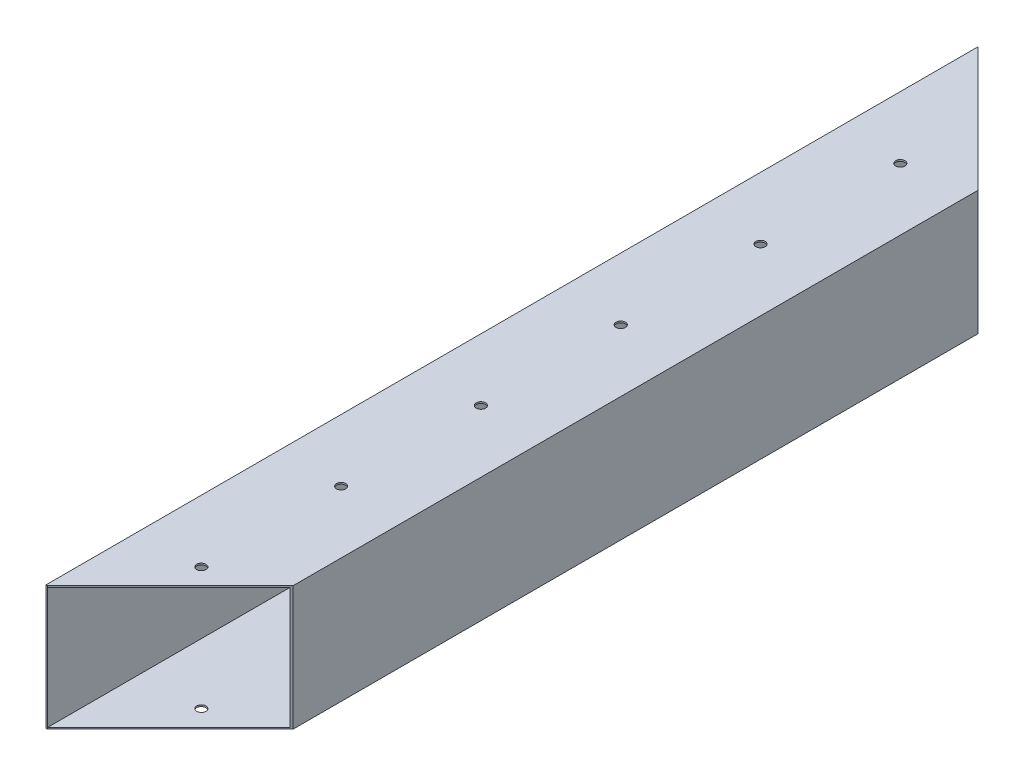
ISO-10303-21;
HEADER;
FILE_DESCRIPTION(('STEP AP214'),'2;1');
FILE_NAME('part.step','',(''),(''),'','','');
FILE_SCHEMA(('AUTOMOTIVE_DESIGN { 1 0 10303 214 1 1 1 1 }'));
ENDSEC;
DATA;
#1=APPLICATION_CONTEXT('core data for automotive mechanical design processes');
#2=APPLICATION_PROTOCOL_DEFINITION('international standard','automotive_design',2000,#1);
#3=PRODUCT_CONTEXT('',#1,'mechanical');
#4=PRODUCT('Part','Part','',(#3));
#5=PRODUCT_RELATED_PRODUCT_CATEGORY('part','',(#4));
#6=PRODUCT_DEFINITION_FORMATION('','',#4);
#7=PRODUCT_DEFINITION_CONTEXT('part definition',#1,'design');
#8=PRODUCT_DEFINITION('design','',#6,#7);
#9=PRODUCT_DEFINITION_SHAPE('','',#8);
#10=(LENGTH_UNIT() NAMED_UNIT(*) SI_UNIT(.MILLI.,.METRE.));
#11=(NAMED_UNIT(*) PLANE_ANGLE_UNIT() SI_UNIT($,.RADIAN.));
#12=(NAMED_UNIT(*) SI_UNIT($,.STERADIAN.) SOLID_ANGLE_UNIT());
#13=UNCERTAINTY_MEASURE_WITH_UNIT(LENGTH_MEASURE(1.E-05),#10,'distance_accuracy_value','');
#14=(GEOMETRIC_REPRESENTATION_CONTEXT(3) GLOBAL_UNCERTAINTY_ASSIGNED_CONTEXT((#13)) GLOBAL_UNIT_ASSIGNED_CONTEXT((#10,
#11,#12)) REPRESENTATION_CONTEXT('',''));
#15=CARTESIAN_POINT('',(0.,0.,0.));
#16=DIRECTION('',(0.,0.,1.));
#17=DIRECTION('',(1.,0.,0.));
#18=AXIS2_PLACEMENT_3D('',#15,#16,#17);
#19=CARTESIAN_POINT('',(20.,20.,300.));
#20=DIRECTION('',(-1.,0.,0.));
#21=DIRECTION('',(0.,-1.,0.));
#22=AXIS2_PLACEMENT_3D('',#19,#20,#21);
#23=PLANE('',#22);
#24=DIRECTION('',(0.,-1.,0.));
#25=VECTOR('',#24,1.);
#26=CARTESIAN_POINT('',(20.,280.,40.0000000000004));
#27=LINE('',#26,#25);
#28=CARTESIAN_POINT('',(20.,20.,40.0000000000004));
#29=VERTEX_POINT('',#28);
#30=CARTESIAN_POINT('',(20.,-20.,40.0000000000004));
#31=VERTEX_POINT('',#30);
#32=EDGE_CURVE('E55',#29,#31,#27,.T.);
#33=ORIENTED_EDGE('',*,*,#32,.F.);
#34=DIRECTION('',(0.,0.,-1.));
#35=VECTOR('',#34,1.);
#36=CARTESIAN_POINT('',(20.,20.,300.));
#37=LINE('',#36,#35);
#38=CARTESIAN_POINT('',(20.,20.,260.5));
#39=VERTEX_POINT('',#38);
#40=EDGE_CURVE('E141',#39,#29,#37,.T.);
#41=ORIENTED_EDGE('',*,*,#40,.F.);
#42=DIRECTION('',(0.,1.,0.));
#43=VECTOR('',#42,1.);
#44=CARTESIAN_POINT('',(20.,-280.,260.5));
#45=LINE('',#44,#43);
#46=CARTESIAN_POINT('',(20.,-20.,260.5));
#47=VERTEX_POINT('',#46);
#48=EDGE_CURVE('E222',#47,#39,#45,.T.);
#49=ORIENTED_EDGE('',*,*,#48,.F.);
#50=DIRECTION('',(0.,0.,-1.));
#51=VECTOR('',#50,1.);
#52=CARTESIAN_POINT('',(20.,-20.,300.));
#53=LINE('',#52,#51);
#54=EDGE_CURVE('E137',#47,#31,#53,.T.);
#55=ORIENTED_EDGE('',*,*,#54,.T.);
#56=EDGE_LOOP('',(#33,#41,#49,#55));
#57=FACE_BOUND('',#56,.T.);
#58=ADVANCED_FACE('F38',(#57),#23,.F.);
#59=CARTESIAN_POINT('',(-20.,20.,300.));
#60=DIRECTION('',(0.,-1.,0.));
#61=DIRECTION('',(0.,0.,-1.));
#62=AXIS2_PLACEMENT_3D('',#59,#60,#61);
#63=PLANE('',#62);
#64=CARTESIAN_POINT('',(0.,20.,45.));
#65=DIRECTION('',(0.,-1.,0.));
#66=DIRECTION('',(0.,0.,-1.));
#67=AXIS2_PLACEMENT_3D('',#64,#65,#66);
#68=CIRCLE('',#67,1.5);
#69=CARTESIAN_POINT('',(0.,20.,43.5));
#70=VERTEX_POINT('',#69);
#71=EDGE_CURVE('E117',#70,#70,#68,.T.);
#72=ORIENTED_EDGE('',*,*,#71,.T.);
#73=EDGE_LOOP('',(#72));
#74=FACE_BOUND('',#73,.T.);
#75=CARTESIAN_POINT('',(0.,20.,90.));
#76=DIRECTION('',(0.,-1.,0.));
#77=DIRECTION('',(0.,0.,-1.));
#78=AXIS2_PLACEMENT_3D('',#75,#76,#77);
#79=CIRCLE('',#78,1.5);
#80=CARTESIAN_POINT('',(0.,20.,88.5));
#81=VERTEX_POINT('',#80);
#82=EDGE_CURVE('E183',#81,#81,#79,.T.);
#83=ORIENTED_EDGE('',*,*,#82,.T.);
#84=EDGE_LOOP('',(#83));
#85=FACE_BOUND('',#84,.T.);
#86=CARTESIAN_POINT('',(0.,20.,135.));
#87=DIRECTION('',(0.,-1.,0.));
#88=DIRECTION('',(0.,0.,-1.));
#89=AXIS2_PLACEMENT_3D('',#86,#87,#88);
#90=CIRCLE('',#89,1.5);
#91=CARTESIAN_POINT('',(0.,20.,133.5));
#92=VERTEX_POINT('',#91);
#93=EDGE_CURVE('E177',#92,#92,#90,.T.);
#94=ORIENTED_EDGE('',*,*,#93,.T.);
#95=EDGE_LOOP('',(#94));
#96=FACE_BOUND('',#95,.T.);
#97=CARTESIAN_POINT('',(0.,20.,180.));
#98=DIRECTION('',(0.,-1.,0.));
#99=DIRECTION('',(0.,0.,-1.));
#100=AXIS2_PLACEMENT_3D('',#97,#98,#99);
#101=CIRCLE('',#100,1.5);
#102=CARTESIAN_POINT('',(0.,20.,178.5));
#103=VERTEX_POINT('',#102);
#104=EDGE_CURVE('E172',#103,#103,#101,.T.);
#105=ORIENTED_EDGE('',*,*,#104,.T.);
#106=EDGE_LOOP('',(#105));
#107=FACE_BOUND('',#106,.T.);
#108=CARTESIAN_POINT('',(0.,20.,225.));
#109=DIRECTION('',(0.,-1.,0.));
#110=DIRECTION('',(0.,0.,-1.));
#111=AXIS2_PLACEMENT_3D('',#108,#109,#110);
#112=CIRCLE('',#111,1.5);
#113=CARTESIAN_POINT('',(0.,20.,223.5));
#114=VERTEX_POINT('',#113);
#115=EDGE_CURVE('E167',#114,#114,#112,.T.);
#116=ORIENTED_EDGE('',*,*,#115,.T.);
#117=EDGE_LOOP('',(#116));
#118=FACE_BOUND('',#117,.T.);
#119=CARTESIAN_POINT('',(0.,20.,270.));
#120=DIRECTION('',(0.,-1.,0.));
#121=DIRECTION('',(0.,0.,-1.));
#122=AXIS2_PLACEMENT_3D('',#119,#120,#121);
#123=CIRCLE('',#122,1.5);
#124=CARTESIAN_POINT('',(0.,20.,268.5));
#125=VERTEX_POINT('',#124);
#126=EDGE_CURVE('E161',#125,#125,#123,.T.);
#127=ORIENTED_EDGE('',*,*,#126,.T.);
#128=EDGE_LOOP('',(#127));
#129=FACE_BOUND('',#128,.T.);
#130=DIRECTION('',(0.707106781186544,0.,0.707106781186551));
#131=VECTOR('',#130,1.);
#132=CARTESIAN_POINT('',(130.,20.,150.000000000002));
#133=LINE('',#132,#131);
#134=CARTESIAN_POINT('',(-20.,20.,0.));
#135=VERTEX_POINT('',#134);
#136=EDGE_CURVE('E216',#135,#29,#133,.T.);
#137=ORIENTED_EDGE('',*,*,#136,.F.);
#138=DIRECTION('',(0.,0.,-1.));
#139=VECTOR('',#138,1.);
#140=CARTESIAN_POINT('',(-20.,20.,300.));
#141=LINE('',#140,#139);
#142=CARTESIAN_POINT('',(-20.,20.,300.));
#143=VERTEX_POINT('',#142);
#144=EDGE_CURVE('E127',#143,#135,#141,.T.);
#145=ORIENTED_EDGE('',*,*,#144,.F.);
#146=DIRECTION('',(-1.,0.,0.));
#147=VECTOR('',#146,1.);
#148=CARTESIAN_POINT('',(-20.,20.,300.));
#149=LINE('',#148,#147);
#150=CARTESIAN_POINT('',(-19.5,20.,300.));
#151=VERTEX_POINT('',#150);
#152=EDGE_CURVE('E129',#151,#143,#149,.T.);
#153=ORIENTED_EDGE('',*,*,#152,.F.);
#154=DIRECTION('',(-0.707106781186549,0.,0.707106781186546));
#155=VECTOR('',#154,1.);
#156=CARTESIAN_POINT('',(-19.5,20.,300.));
#157=LINE('',#156,#155);
#158=EDGE_CURVE('E219',#39,#151,#157,.T.);
#159=ORIENTED_EDGE('',*,*,#158,.F.);
#160=ORIENTED_EDGE('',*,*,#40,.T.);
#161=EDGE_LOOP('',(#137,#145,#153,#159,#160));
#162=FACE_BOUND('',#161,.T.);
#163=ADVANCED_FACE('F272',(#74,#85,#96,#107,#118,#129,#162),#63,.F.);
#164=CARTESIAN_POINT('',(-20.,-20.,300.));
#165=DIRECTION('',(0.,1.,0.));
#166=DIRECTION('',(0.,0.,1.));
#167=AXIS2_PLACEMENT_3D('',#164,#165,#166);
#168=PLANE('',#167);
#169=CARTESIAN_POINT('',(0.,-20.,45.));
#170=DIRECTION('',(0.,-1.,0.));
#171=DIRECTION('',(0.,0.,-1.));
#172=AXIS2_PLACEMENT_3D('',#169,#170,#171);
#173=CIRCLE('',#172,1.5);
#174=CARTESIAN_POINT('',(0.,-20.,43.5));
#175=VERTEX_POINT('',#174);
#176=EDGE_CURVE('E155',#175,#175,#173,.T.);
#177=ORIENTED_EDGE('',*,*,#176,.F.);
#178=EDGE_LOOP('',(#177));
#179=FACE_BOUND('',#178,.T.);
#180=CARTESIAN_POINT('',(0.,-20.,90.));
#181=DIRECTION('',(0.,-1.,0.));
#182=DIRECTION('',(0.,0.,-1.));
#183=AXIS2_PLACEMENT_3D('',#180,#181,#182);
#184=CIRCLE('',#183,1.5);
#185=CARTESIAN_POINT('',(0.,-20.,88.5));
#186=VERTEX_POINT('',#185);
#187=EDGE_CURVE('E566',#186,#186,#184,.T.);
#188=ORIENTED_EDGE('',*,*,#187,.F.);
#189=EDGE_LOOP('',(#188));
#190=FACE_BOUND('',#189,.T.);
#191=CARTESIAN_POINT('',(0.,-20.,135.));
#192=DIRECTION('',(0.,-1.,0.));
#193=DIRECTION('',(0.,0.,-1.));
#194=AXIS2_PLACEMENT_3D('',#191,#192,#193);
#195=CIRCLE('',#194,1.5);
#196=CARTESIAN_POINT('',(0.,-20.,133.5));
#197=VERTEX_POINT('',#196);
#198=EDGE_CURVE('E562',#197,#197,#195,.T.);
#199=ORIENTED_EDGE('',*,*,#198,.F.);
#200=EDGE_LOOP('',(#199));
#201=FACE_BOUND('',#200,.T.);
#202=CARTESIAN_POINT('',(0.,-20.,180.));
#203=DIRECTION('',(0.,-1.,0.));
#204=DIRECTION('',(0.,0.,-1.));
#205=AXIS2_PLACEMENT_3D('',#202,#203,#204);
#206=CIRCLE('',#205,1.5);
#207=CARTESIAN_POINT('',(0.,-20.,178.5));
#208=VERTEX_POINT('',#207);
#209=EDGE_CURVE('E558',#208,#208,#206,.T.);
#210=ORIENTED_EDGE('',*,*,#209,.F.);
#211=EDGE_LOOP('',(#210));
#212=FACE_BOUND('',#211,.T.);
#213=CARTESIAN_POINT('',(0.,-20.,225.));
#214=DIRECTION('',(0.,-1.,0.));
#215=DIRECTION('',(0.,0.,-1.));
#216=AXIS2_PLACEMENT_3D('',#213,#214,#215);
#217=CIRCLE('',#216,1.5);
#218=CARTESIAN_POINT('',(0.,-20.,223.5));
#219=VERTEX_POINT('',#218);
#220=EDGE_CURVE('E554',#219,#219,#217,.T.);
#221=ORIENTED_EDGE('',*,*,#220,.F.);
#222=EDGE_LOOP('',(#221));
#223=FACE_BOUND('',#222,.T.);
#224=CARTESIAN_POINT('',(0.,-20.,270.));
#225=DIRECTION('',(0.,-1.,0.));
#226=DIRECTION('',(0.,0.,-1.));
#227=AXIS2_PLACEMENT_3D('',#224,#225,#226);
#228=CIRCLE('',#227,1.5);
#229=CARTESIAN_POINT('',(0.,-20.,268.5));
#230=VERTEX_POINT('',#229);
#231=EDGE_CURVE('E532',#230,#230,#228,.T.);
#232=ORIENTED_EDGE('',*,*,#231,.F.);
#233=EDGE_LOOP('',(#232));
#234=FACE_BOUND('',#233,.T.);
#235=DIRECTION('',(0.707106781186544,0.,0.707106781186551));
#236=VECTOR('',#235,1.);
#237=CARTESIAN_POINT('',(-20.,-20.,0.));
#238=LINE('',#237,#236);
#239=CARTESIAN_POINT('',(-20.,-20.,0.));
#240=VERTEX_POINT('',#239);
#241=EDGE_CURVE('E107',#240,#31,#238,.T.);
#242=ORIENTED_EDGE('',*,*,#241,.T.);
#243=ORIENTED_EDGE('',*,*,#54,.F.);
#244=DIRECTION('',(-0.707106781186549,0.,0.707106781186546));
#245=VECTOR('',#244,1.);
#246=CARTESIAN_POINT('',(-19.75,-20.,300.25));
#247=LINE('',#246,#245);
#248=CARTESIAN_POINT('',(-19.5,-20.,300.));
#249=VERTEX_POINT('',#248);
#250=EDGE_CURVE('E236',#47,#249,#247,.T.);
#251=ORIENTED_EDGE('',*,*,#250,.T.);
#252=DIRECTION('',(1.,0.,0.));
#253=VECTOR('',#252,1.);
#254=CARTESIAN_POINT('',(-20.,-20.,300.));
#255=LINE('',#254,#253);
#256=CARTESIAN_POINT('',(-20.,-20.,300.));
#257=VERTEX_POINT('',#256);
#258=EDGE_CURVE('E135',#257,#249,#255,.T.);
#259=ORIENTED_EDGE('',*,*,#258,.F.);
#260=DIRECTION('',(0.,0.,-1.));
#261=VECTOR('',#260,1.);
#262=CARTESIAN_POINT('',(-20.,-20.,300.));
#263=LINE('',#262,#261);
#264=EDGE_CURVE('E124',#257,#240,#263,.T.);
#265=ORIENTED_EDGE('',*,*,#264,.T.);
#266=EDGE_LOOP('',(#242,#243,#251,#259,#265));
#267=FACE_BOUND('',#266,.T.);
#268=ADVANCED_FACE('F132',(#179,#190,#201,#212,#223,#234,#267),#168,.F.);
#269=CARTESIAN_POINT('',(19.5,19.5,300.));
#270=DIRECTION('',(-1.,0.,0.));
#271=DIRECTION('',(0.,-1.,0.));
#272=AXIS2_PLACEMENT_3D('',#269,#270,#271);
#273=PLANE('',#272);
#274=DIRECTION('',(0.,0.,-1.));
#275=VECTOR('',#274,1.);
#276=CARTESIAN_POINT('',(19.5,19.5,300.));
#277=LINE('',#276,#275);
#278=CARTESIAN_POINT('',(19.5,19.5,261.));
#279=VERTEX_POINT('',#278);
#280=CARTESIAN_POINT('',(19.5,19.5,39.5000000000004));
#281=VERTEX_POINT('',#280);
#282=EDGE_CURVE('E130',#279,#281,#277,.T.);
#283=ORIENTED_EDGE('',*,*,#282,.T.);
#284=DIRECTION('',(0.,-1.,0.));
#285=VECTOR('',#284,1.);
#286=CARTESIAN_POINT('',(19.5,19.4999999999999,39.5000000000004));
#287=LINE('',#286,#285);
#288=CARTESIAN_POINT('',(19.5,-19.5,39.5000000000005));
#289=VERTEX_POINT('',#288);
#290=EDGE_CURVE('E212',#281,#289,#287,.T.);
#291=ORIENTED_EDGE('',*,*,#290,.T.);
#292=DIRECTION('',(0.,0.,-1.));
#293=VECTOR('',#292,1.);
#294=CARTESIAN_POINT('',(19.5,-19.5,300.));
#295=LINE('',#294,#293);
#296=CARTESIAN_POINT('',(19.5,-19.5,261.));
#297=VERTEX_POINT('',#296);
#298=EDGE_CURVE('E243',#297,#289,#295,.T.);
#299=ORIENTED_EDGE('',*,*,#298,.F.);
#300=DIRECTION('',(0.,-1.,0.));
#301=VECTOR('',#300,1.);
#302=CARTESIAN_POINT('',(19.5,19.5,261.));
#303=LINE('',#302,#301);
#304=EDGE_CURVE('E230',#279,#297,#303,.T.);
#305=ORIENTED_EDGE('',*,*,#304,.F.);
#306=EDGE_LOOP('',(#283,#291,#299,#305));
#307=FACE_BOUND('',#306,.T.);
#308=ADVANCED_FACE('F304',(#307),#273,.T.);
#309=CARTESIAN_POINT('',(-19.5,19.5,300.));
#310=DIRECTION('',(0.,-1.,0.));
#311=DIRECTION('',(0.,0.,-1.));
#312=AXIS2_PLACEMENT_3D('',#309,#310,#311);
#313=PLANE('',#312);
#314=CARTESIAN_POINT('',(0.,19.5,45.));
#315=DIRECTION('',(0.,-1.,0.));
#316=DIRECTION('',(0.,0.,-1.));
#317=AXIS2_PLACEMENT_3D('',#314,#315,#316);
#318=CIRCLE('',#317,1.5);
#319=CARTESIAN_POINT('',(0.,19.5,43.5));
#320=VERTEX_POINT('',#319);
#321=EDGE_CURVE('E197',#320,#320,#318,.T.);
#322=ORIENTED_EDGE('',*,*,#321,.F.);
#323=EDGE_LOOP('',(#322));
#324=FACE_BOUND('',#323,.T.);
#325=CARTESIAN_POINT('',(0.,19.5,90.));
#326=DIRECTION('',(0.,-1.,0.));
#327=DIRECTION('',(0.,0.,-1.));
#328=AXIS2_PLACEMENT_3D('',#325,#326,#327);
#329=CIRCLE('',#328,1.5);
#330=CARTESIAN_POINT('',(0.,19.5,88.5));
#331=VERTEX_POINT('',#330);
#332=EDGE_CURVE('E176',#331,#331,#329,.T.);
#333=ORIENTED_EDGE('',*,*,#332,.F.);
#334=EDGE_LOOP('',(#333));
#335=FACE_BOUND('',#334,.T.);
#336=CARTESIAN_POINT('',(0.,19.5,135.));
#337=DIRECTION('',(0.,-1.,0.));
#338=DIRECTION('',(0.,0.,-1.));
#339=AXIS2_PLACEMENT_3D('',#336,#337,#338);
#340=CIRCLE('',#339,1.5);
#341=CARTESIAN_POINT('',(0.,19.5,133.5));
#342=VERTEX_POINT('',#341);
#343=EDGE_CURVE('E171',#342,#342,#340,.T.);
#344=ORIENTED_EDGE('',*,*,#343,.F.);
#345=EDGE_LOOP('',(#344));
#346=FACE_BOUND('',#345,.T.);
#347=CARTESIAN_POINT('',(0.,19.5,180.));
#348=DIRECTION('',(0.,-1.,0.));
#349=DIRECTION('',(0.,0.,-1.));
#350=AXIS2_PLACEMENT_3D('',#347,#348,#349);
#351=CIRCLE('',#350,1.5);
#352=CARTESIAN_POINT('',(0.,19.5,178.5));
#353=VERTEX_POINT('',#352);
#354=EDGE_CURVE('E166',#353,#353,#351,.T.);
#355=ORIENTED_EDGE('',*,*,#354,.F.);
#356=EDGE_LOOP('',(#355));
#357=FACE_BOUND('',#356,.T.);
#358=CARTESIAN_POINT('',(0.,19.5,225.));
#359=DIRECTION('',(0.,-1.,0.));
#360=DIRECTION('',(0.,0.,-1.));
#361=AXIS2_PLACEMENT_3D('',#358,#359,#360);
#362=CIRCLE('',#361,1.5);
#363=CARTESIAN_POINT('',(0.,19.5,223.5));
#364=VERTEX_POINT('',#363);
#365=EDGE_CURVE('E160',#364,#364,#362,.T.);
#366=ORIENTED_EDGE('',*,*,#365,.F.);
#367=EDGE_LOOP('',(#366));
#368=FACE_BOUND('',#367,.T.);
#369=CARTESIAN_POINT('',(0.,19.5,270.));
#370=DIRECTION('',(0.,-1.,0.));
#371=DIRECTION('',(0.,0.,-1.));
#372=AXIS2_PLACEMENT_3D('',#369,#370,#371);
#373=CIRCLE('',#372,1.5);
#374=CARTESIAN_POINT('',(0.,19.5,268.5));
#375=VERTEX_POINT('',#374);
#376=EDGE_CURVE('E154',#375,#375,#373,.T.);
#377=ORIENTED_EDGE('',*,*,#376,.F.);
#378=EDGE_LOOP('',(#377));
#379=FACE_BOUND('',#378,.T.);
#380=DIRECTION('',(0.,0.,-1.));
#381=VECTOR('',#380,1.);
#382=CARTESIAN_POINT('',(-19.5,19.5,300.));
#383=LINE('',#382,#381);
#384=CARTESIAN_POINT('',(-19.5,19.5,300.));
#385=VERTEX_POINT('',#384);
#386=CARTESIAN_POINT('',(-19.5,19.5,0.5));
#387=VERTEX_POINT('',#386);
#388=EDGE_CURVE('E251',#385,#387,#383,.T.);
#389=ORIENTED_EDGE('',*,*,#388,.T.);
#390=DIRECTION('',(0.707106781186544,0.,0.707106781186551));
#391=VECTOR('',#390,1.);
#392=CARTESIAN_POINT('',(130.25,19.5,150.250000000002));
#393=LINE('',#392,#391);
#394=EDGE_CURVE('E208',#387,#281,#393,.T.);
#395=ORIENTED_EDGE('',*,*,#394,.T.);
#396=ORIENTED_EDGE('',*,*,#282,.F.);
#397=DIRECTION('',(0.707106781186549,0.,-0.707106781186546));
#398=VECTOR('',#397,1.);
#399=CARTESIAN_POINT('',(-19.5,19.5,300.));
#400=LINE('',#399,#398);
#401=EDGE_CURVE('E233',#385,#279,#400,.T.);
#402=ORIENTED_EDGE('',*,*,#401,.F.);
#403=EDGE_LOOP('',(#389,#395,#396,#402));
#404=FACE_BOUND('',#403,.T.);
#405=ADVANCED_FACE('F307',(#324,#335,#346,#357,#368,#379,#404),#313,.T.);
#406=CARTESIAN_POINT('',(-19.5,19.5,300.));
#407=DIRECTION('',(1.,0.,0.));
#408=DIRECTION('',(0.,1.,0.));
#409=AXIS2_PLACEMENT_3D('',#406,#407,#408);
#410=PLANE('',#409);
#411=DIRECTION('',(0.,0.,-1.));
#412=VECTOR('',#411,1.);
#413=CARTESIAN_POINT('',(-19.5,-19.5,300.));
#414=LINE('',#413,#412);
#415=CARTESIAN_POINT('',(-19.5,-19.5,300.));
#416=VERTEX_POINT('',#415);
#417=CARTESIAN_POINT('',(-19.5,-19.5,0.500000000000014));
#418=VERTEX_POINT('',#417);
#419=EDGE_CURVE('E247',#416,#418,#414,.T.);
#420=ORIENTED_EDGE('',*,*,#419,.T.);
#421=DIRECTION('',(0.,1.,0.));
#422=VECTOR('',#421,1.);
#423=CARTESIAN_POINT('',(-19.5,19.5,0.5));
#424=LINE('',#423,#422);
#425=EDGE_CURVE('E63',#418,#387,#424,.T.);
#426=ORIENTED_EDGE('',*,*,#425,.T.);
#427=ORIENTED_EDGE('',*,*,#388,.F.);
#428=DIRECTION('',(0.,-1.,0.));
#429=VECTOR('',#428,1.);
#430=CARTESIAN_POINT('',(-19.5,19.5,300.));
#431=LINE('',#430,#429);
#432=EDGE_CURVE('E239',#385,#416,#431,.T.);
#433=ORIENTED_EDGE('',*,*,#432,.T.);
#434=EDGE_LOOP('',(#420,#426,#427,#433));
#435=FACE_BOUND('',#434,.T.);
#436=ADVANCED_FACE('F290',(#435),#410,.T.);
#437=CARTESIAN_POINT('',(-19.5,-19.5,300.));
#438=DIRECTION('',(0.,1.,0.));
#439=DIRECTION('',(0.,0.,1.));
#440=AXIS2_PLACEMENT_3D('',#437,#438,#439);
#441=PLANE('',#440);
#442=CARTESIAN_POINT('',(0.,-19.5,45.));
#443=DIRECTION('',(0.,1.,0.));
#444=DIRECTION('',(0.,0.,1.));
#445=AXIS2_PLACEMENT_3D('',#442,#443,#444);
#446=CIRCLE('',#445,1.5);
#447=CARTESIAN_POINT('',(0.,-19.5,46.5));
#448=VERTEX_POINT('',#447);
#449=EDGE_CURVE('E41',#448,#448,#446,.T.);
#450=ORIENTED_EDGE('',*,*,#449,.F.);
#451=EDGE_LOOP('',(#450));
#452=FACE_BOUND('',#451,.T.);
#453=CARTESIAN_POINT('',(0.,-19.5,90.));
#454=DIRECTION('',(0.,1.,0.));
#455=DIRECTION('',(0.,0.,1.));
#456=AXIS2_PLACEMENT_3D('',#453,#454,#455);
#457=CIRCLE('',#456,1.5);
#458=CARTESIAN_POINT('',(0.,-19.5,91.5));
#459=VERTEX_POINT('',#458);
#460=EDGE_CURVE('E173',#459,#459,#457,.T.);
#461=ORIENTED_EDGE('',*,*,#460,.F.);
#462=EDGE_LOOP('',(#461));
#463=FACE_BOUND('',#462,.T.);
#464=CARTESIAN_POINT('',(0.,-19.5,135.));
#465=DIRECTION('',(0.,1.,0.));
#466=DIRECTION('',(0.,0.,1.));
#467=AXIS2_PLACEMENT_3D('',#464,#465,#466);
#468=CIRCLE('',#467,1.5);
#469=CARTESIAN_POINT('',(0.,-19.5,136.5));
#470=VERTEX_POINT('',#469);
#471=EDGE_CURVE('E168',#470,#470,#468,.T.);
#472=ORIENTED_EDGE('',*,*,#471,.F.);
#473=EDGE_LOOP('',(#472));
#474=FACE_BOUND('',#473,.T.);
#475=CARTESIAN_POINT('',(0.,-19.5,180.));
#476=DIRECTION('',(0.,1.,0.));
#477=DIRECTION('',(0.,0.,1.));
#478=AXIS2_PLACEMENT_3D('',#475,#476,#477);
#479=CIRCLE('',#478,1.5);
#480=CARTESIAN_POINT('',(0.,-19.5,181.5));
#481=VERTEX_POINT('',#480);
#482=EDGE_CURVE('E162',#481,#481,#479,.T.);
#483=ORIENTED_EDGE('',*,*,#482,.F.);
#484=EDGE_LOOP('',(#483));
#485=FACE_BOUND('',#484,.T.);
#486=CARTESIAN_POINT('',(0.,-19.5,225.));
#487=DIRECTION('',(0.,1.,0.));
#488=DIRECTION('',(0.,0.,1.));
#489=AXIS2_PLACEMENT_3D('',#486,#487,#488);
#490=CIRCLE('',#489,1.5);
#491=CARTESIAN_POINT('',(0.,-19.5,226.5));
#492=VERTEX_POINT('',#491);
#493=EDGE_CURVE('E156',#492,#492,#490,.T.);
#494=ORIENTED_EDGE('',*,*,#493,.F.);
#495=EDGE_LOOP('',(#494));
#496=FACE_BOUND('',#495,.T.);
#497=CARTESIAN_POINT('',(0.,-19.5,270.));
#498=DIRECTION('',(0.,1.,0.));
#499=DIRECTION('',(0.,0.,1.));
#500=AXIS2_PLACEMENT_3D('',#497,#498,#499);
#501=CIRCLE('',#500,1.5);
#502=CARTESIAN_POINT('',(0.,-19.5,271.5));
#503=VERTEX_POINT('',#502);
#504=EDGE_CURVE('E150',#503,#503,#501,.T.);
#505=ORIENTED_EDGE('',*,*,#504,.F.);
#506=EDGE_LOOP('',(#505));
#507=FACE_BOUND('',#506,.T.);
#508=ORIENTED_EDGE('',*,*,#298,.T.);
#509=DIRECTION('',(-0.707106781186544,0.,-0.707106781186551));
#510=VECTOR('',#509,1.);
#511=CARTESIAN_POINT('',(130.25,-19.5,150.250000000002));
#512=LINE('',#511,#510);
#513=EDGE_CURVE('E11',#289,#418,#512,.T.);
#514=ORIENTED_EDGE('',*,*,#513,.T.);
#515=ORIENTED_EDGE('',*,*,#419,.F.);
#516=DIRECTION('',(-0.707106781186549,0.,0.707106781186546));
#517=VECTOR('',#516,1.);
#518=CARTESIAN_POINT('',(-19.5,-19.5,300.));
#519=LINE('',#518,#517);
#520=EDGE_CURVE('E47',#297,#416,#519,.T.);
#521=ORIENTED_EDGE('',*,*,#520,.F.);
#522=EDGE_LOOP('',(#508,#514,#515,#521));
#523=FACE_BOUND('',#522,.T.);
#524=ADVANCED_FACE('F287',(#452,#463,#474,#485,#496,#507,#523),#441,.T.);
#525=CARTESIAN_POINT('',(0.,0.,300.));
#526=DIRECTION('',(0.,0.,1.));
#527=DIRECTION('',(1.,0.,0.));
#528=AXIS2_PLACEMENT_3D('',#525,#526,#527);
#529=PLANE('',#528);
#530=DIRECTION('',(0.,1.,0.));
#531=VECTOR('',#530,1.);
#532=CARTESIAN_POINT('',(-19.5,-280.,300.));
#533=LINE('',#532,#531);
#534=EDGE_CURVE('E223',#385,#151,#533,.T.);
#535=ORIENTED_EDGE('',*,*,#534,.T.);
#536=ORIENTED_EDGE('',*,*,#152,.T.);
#537=DIRECTION('',(0.,-1.,0.));
#538=VECTOR('',#537,1.);
#539=CARTESIAN_POINT('',(-20.,20.,300.));
#540=LINE('',#539,#538);
#541=EDGE_CURVE('E260',#143,#257,#540,.T.);
#542=ORIENTED_EDGE('',*,*,#541,.T.);
#543=ORIENTED_EDGE('',*,*,#258,.T.);
#544=EDGE_CURVE('E227',#249,#416,#533,.T.);
#545=ORIENTED_EDGE('',*,*,#544,.T.);
#546=ORIENTED_EDGE('',*,*,#432,.F.);
#547=EDGE_LOOP('',(#535,#536,#542,#543,#545,#546));
#548=FACE_BOUND('',#547,.T.);
#549=ADVANCED_FACE('F266',(#548),#529,.T.);
#550=CARTESIAN_POINT('',(-20.,20.,300.));
#551=DIRECTION('',(1.,0.,0.));
#552=DIRECTION('',(0.,1.,0.));
#553=AXIS2_PLACEMENT_3D('',#550,#551,#552);
#554=PLANE('',#553);
#555=DIRECTION('',(0.,-1.,0.));
#556=VECTOR('',#555,1.);
#557=CARTESIAN_POINT('',(-20.,20.,0.));
#558=LINE('',#557,#556);
#559=EDGE_CURVE('E110',#135,#240,#558,.T.);
#560=ORIENTED_EDGE('',*,*,#559,.T.);
#561=ORIENTED_EDGE('',*,*,#264,.F.);
#562=ORIENTED_EDGE('',*,*,#541,.F.);
#563=ORIENTED_EDGE('',*,*,#144,.T.);
#564=EDGE_LOOP('',(#560,#561,#562,#563));
#565=FACE_BOUND('',#564,.T.);
#566=ADVANCED_FACE('F122',(#565),#554,.F.);
#567=CARTESIAN_POINT('',(-19.5,-280.,300.));
#568=DIRECTION('',(-0.707106781186546,0.,-0.707106781186549));
#569=DIRECTION('',(-0.707106781186549,0.,0.707106781186546));
#570=AXIS2_PLACEMENT_3D('',#567,#568,#569);
#571=PLANE('',#570);
#572=ORIENTED_EDGE('',*,*,#48,.T.);
#573=ORIENTED_EDGE('',*,*,#158,.T.);
#574=ORIENTED_EDGE('',*,*,#534,.F.);
#575=ORIENTED_EDGE('',*,*,#401,.T.);
#576=ORIENTED_EDGE('',*,*,#304,.T.);
#577=ORIENTED_EDGE('',*,*,#520,.T.);
#578=ORIENTED_EDGE('',*,*,#544,.F.);
#579=ORIENTED_EDGE('',*,*,#250,.F.);
#580=EDGE_LOOP('',(#572,#573,#574,#575,#576,#577,#578,#579));
#581=FACE_BOUND('',#580,.T.);
#582=ADVANCED_FACE('F277',(#581),#571,.F.);
#583=CARTESIAN_POINT('',(-20.,280.,0.));
#584=DIRECTION('',(0.707106781186551,0.,-0.707106781186544));
#585=DIRECTION('',(-0.707106781186544,0.,-0.707106781186551));
#586=AXIS2_PLACEMENT_3D('',#583,#584,#585);
#587=PLANE('',#586);
#588=ORIENTED_EDGE('',*,*,#394,.F.);
#589=ORIENTED_EDGE('',*,*,#425,.F.);
#590=ORIENTED_EDGE('',*,*,#513,.F.);
#591=ORIENTED_EDGE('',*,*,#290,.F.);
#592=EDGE_LOOP('',(#588,#589,#590,#591));
#593=FACE_BOUND('',#592,.T.);
#594=ORIENTED_EDGE('',*,*,#136,.T.);
#595=ORIENTED_EDGE('',*,*,#32,.T.);
#596=ORIENTED_EDGE('',*,*,#241,.F.);
#597=ORIENTED_EDGE('',*,*,#559,.F.);
#598=EDGE_LOOP('',(#594,#595,#596,#597));
#599=FACE_BOUND('',#598,.T.);
#600=ADVANCED_FACE('F109',(#593,#599),#587,.T.);
#601=CARTESIAN_POINT('',(0.,530.,270.));
#602=DIRECTION('',(0.,-1.,0.));
#603=DIRECTION('',(0.,0.,-1.));
#604=AXIS2_PLACEMENT_3D('',#601,#602,#603);
#605=CYLINDRICAL_SURFACE('',#604,1.5);
#606=ORIENTED_EDGE('',*,*,#504,.T.);
#607=EDGE_LOOP('',(#606));
#608=FACE_BOUND('',#607,.T.);
#609=ORIENTED_EDGE('',*,*,#231,.T.);
#610=EDGE_LOOP('',(#609));
#611=FACE_BOUND('',#610,.T.);
#612=ADVANCED_FACE('F366',(#608,#611),#605,.F.);
#613=CARTESIAN_POINT('',(0.,530.,225.));
#614=DIRECTION('',(0.,-1.,0.));
#615=DIRECTION('',(0.,0.,-1.));
#616=AXIS2_PLACEMENT_3D('',#613,#614,#615);
#617=CYLINDRICAL_SURFACE('',#616,1.5);
#618=ORIENTED_EDGE('',*,*,#493,.T.);
#619=EDGE_LOOP('',(#618));
#620=FACE_BOUND('',#619,.T.);
#621=ORIENTED_EDGE('',*,*,#220,.T.);
#622=EDGE_LOOP('',(#621));
#623=FACE_BOUND('',#622,.T.);
#624=ADVANCED_FACE('F374',(#620,#623),#617,.F.);
#625=CARTESIAN_POINT('',(0.,530.,180.));
#626=DIRECTION('',(0.,-1.,0.));
#627=DIRECTION('',(0.,0.,-1.));
#628=AXIS2_PLACEMENT_3D('',#625,#626,#627);
#629=CYLINDRICAL_SURFACE('',#628,1.5);
#630=ORIENTED_EDGE('',*,*,#482,.T.);
#631=EDGE_LOOP('',(#630));
#632=FACE_BOUND('',#631,.T.);
#633=ORIENTED_EDGE('',*,*,#209,.T.);
#634=EDGE_LOOP('',(#633));
#635=FACE_BOUND('',#634,.T.);
#636=ADVANCED_FACE('F384',(#632,#635),#629,.F.);
#637=CARTESIAN_POINT('',(0.,530.,135.));
#638=DIRECTION('',(0.,-1.,0.));
#639=DIRECTION('',(0.,0.,-1.));
#640=AXIS2_PLACEMENT_3D('',#637,#638,#639);
#641=CYLINDRICAL_SURFACE('',#640,1.5);
#642=ORIENTED_EDGE('',*,*,#471,.T.);
#643=EDGE_LOOP('',(#642));
#644=FACE_BOUND('',#643,.T.);
#645=ORIENTED_EDGE('',*,*,#198,.T.);
#646=EDGE_LOOP('',(#645));
#647=FACE_BOUND('',#646,.T.);
#648=ADVANCED_FACE('F394',(#644,#647),#641,.F.);
#649=CARTESIAN_POINT('',(0.,530.,90.));
#650=DIRECTION('',(0.,-1.,0.));
#651=DIRECTION('',(0.,0.,-1.));
#652=AXIS2_PLACEMENT_3D('',#649,#650,#651);
#653=CYLINDRICAL_SURFACE('',#652,1.5);
#654=ORIENTED_EDGE('',*,*,#460,.T.);
#655=EDGE_LOOP('',(#654));
#656=FACE_BOUND('',#655,.T.);
#657=ORIENTED_EDGE('',*,*,#187,.T.);
#658=EDGE_LOOP('',(#657));
#659=FACE_BOUND('',#658,.T.);
#660=ADVANCED_FACE('F404',(#656,#659),#653,.F.);
#661=CARTESIAN_POINT('',(0.,530.,45.));
#662=DIRECTION('',(0.,-1.,0.));
#663=DIRECTION('',(0.,0.,-1.));
#664=AXIS2_PLACEMENT_3D('',#661,#662,#663);
#665=CYLINDRICAL_SURFACE('',#664,1.5);
#666=ORIENTED_EDGE('',*,*,#449,.T.);
#667=EDGE_LOOP('',(#666));
#668=FACE_BOUND('',#667,.T.);
#669=ORIENTED_EDGE('',*,*,#176,.T.);
#670=EDGE_LOOP('',(#669));
#671=FACE_BOUND('',#670,.T.);
#672=ADVANCED_FACE('F284',(#668,#671),#665,.F.);
#673=ORIENTED_EDGE('',*,*,#376,.T.);
#674=EDGE_LOOP('',(#673));
#675=FACE_BOUND('',#674,.T.);
#676=ORIENTED_EDGE('',*,*,#126,.F.);
#677=EDGE_LOOP('',(#676));
#678=FACE_BOUND('',#677,.T.);
#679=ADVANCED_FACE('F377',(#675,#678),#605,.F.);
#680=ORIENTED_EDGE('',*,*,#365,.T.);
#681=EDGE_LOOP('',(#680));
#682=FACE_BOUND('',#681,.T.);
#683=ORIENTED_EDGE('',*,*,#115,.F.);
#684=EDGE_LOOP('',(#683));
#685=FACE_BOUND('',#684,.T.);
#686=ADVANCED_FACE('F387',(#682,#685),#617,.F.);
#687=ORIENTED_EDGE('',*,*,#354,.T.);
#688=EDGE_LOOP('',(#687));
#689=FACE_BOUND('',#688,.T.);
#690=ORIENTED_EDGE('',*,*,#104,.F.);
#691=EDGE_LOOP('',(#690));
#692=FACE_BOUND('',#691,.T.);
#693=ADVANCED_FACE('F397',(#689,#692),#629,.F.);
#694=ORIENTED_EDGE('',*,*,#343,.T.);
#695=EDGE_LOOP('',(#694));
#696=FACE_BOUND('',#695,.T.);
#697=ORIENTED_EDGE('',*,*,#93,.F.);
#698=EDGE_LOOP('',(#697));
#699=FACE_BOUND('',#698,.T.);
#700=ADVANCED_FACE('F407',(#696,#699),#641,.F.);
#701=ORIENTED_EDGE('',*,*,#332,.T.);
#702=EDGE_LOOP('',(#701));
#703=FACE_BOUND('',#702,.T.);
#704=ORIENTED_EDGE('',*,*,#82,.F.);
#705=EDGE_LOOP('',(#704));
#706=FACE_BOUND('',#705,.T.);
#707=ADVANCED_FACE('F415',(#703,#706),#653,.F.);
#708=ORIENTED_EDGE('',*,*,#321,.T.);
#709=EDGE_LOOP('',(#708));
#710=FACE_BOUND('',#709,.T.);
#711=ORIENTED_EDGE('',*,*,#71,.F.);
#712=EDGE_LOOP('',(#711));
#713=FACE_BOUND('',#712,.T.);
#714=ADVANCED_FACE('F423',(#710,#713),#665,.F.);
#715=CLOSED_SHELL('',(#58,#163,#268,#308,#405,#436,#524,#549,#566,#582,#600,#612,#624,#636,#648,
#660,#672,#679,#686,#693,#700,#707,#714));
#716=MANIFOLD_SOLID_BREP('B2',#715);
#717=ADVANCED_BREP_SHAPE_REPRESENTATION('',(#18,#716),#14);
#718=SHAPE_DEFINITION_REPRESENTATION(#9,#717);
ENDSEC;
END-ISO-10303-21;
